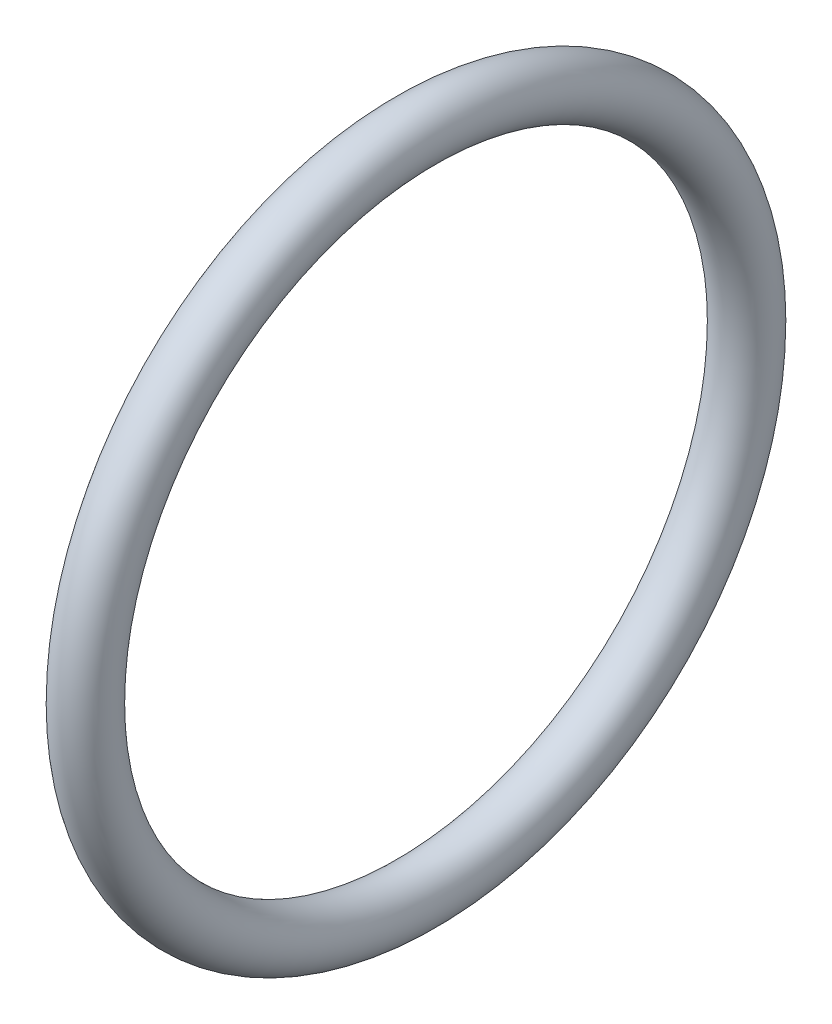
ISO-10303-21;
HEADER;
FILE_DESCRIPTION(('STEP AP214'),'2;1');
FILE_NAME('part.step','',(''),(''),'','','');
FILE_SCHEMA(('AUTOMOTIVE_DESIGN { 1 0 10303 214 1 1 1 1 }'));
ENDSEC;
DATA;
#1=APPLICATION_CONTEXT('core data for automotive mechanical design processes');
#2=APPLICATION_PROTOCOL_DEFINITION('international standard','automotive_design',2000,#1);
#3=PRODUCT_CONTEXT('',#1,'mechanical');
#4=PRODUCT('Part','Part','',(#3));
#5=PRODUCT_RELATED_PRODUCT_CATEGORY('part','',(#4));
#6=PRODUCT_DEFINITION_FORMATION('','',#4);
#7=PRODUCT_DEFINITION_CONTEXT('part definition',#1,'design');
#8=PRODUCT_DEFINITION('design','',#6,#7);
#9=PRODUCT_DEFINITION_SHAPE('','',#8);
#10=(LENGTH_UNIT() NAMED_UNIT(*) SI_UNIT(.MILLI.,.METRE.));
#11=(NAMED_UNIT(*) PLANE_ANGLE_UNIT() SI_UNIT($,.RADIAN.));
#12=(NAMED_UNIT(*) SI_UNIT($,.STERADIAN.) SOLID_ANGLE_UNIT());
#13=UNCERTAINTY_MEASURE_WITH_UNIT(LENGTH_MEASURE(1.E-05),#10,'distance_accuracy_value','');
#14=(GEOMETRIC_REPRESENTATION_CONTEXT(3) GLOBAL_UNCERTAINTY_ASSIGNED_CONTEXT((#13)) GLOBAL_UNIT_ASSIGNED_CONTEXT((#10,
#11,#12)) REPRESENTATION_CONTEXT('',''));
#15=CARTESIAN_POINT('',(0.,0.,0.));
#16=DIRECTION('',(0.,0.,1.));
#17=DIRECTION('',(1.,0.,0.));
#18=AXIS2_PLACEMENT_3D('',#15,#16,#17);
#19=CARTESIAN_POINT('',(0.,0.,0.));
#20=DIRECTION('',(-1.,0.,0.));
#21=DIRECTION('',(0.,0.,1.));
#22=AXIS2_PLACEMENT_3D('',#19,#20,#21);
#23=TOROIDAL_SURFACE('',#22,32.75,2.75);
#24=CARTESIAN_POINT('',(0.,0.,35.5));
#25=VERTEX_POINT('',#24);
#26=VERTEX_LOOP('',#25);
#27=FACE_BOUND('',#26,.T.);
#28=ADVANCED_FACE('F13',(#27),#23,.T.);
#29=CLOSED_SHELL('',(#28));
#30=MANIFOLD_SOLID_BREP('B1',#29);
#31=ADVANCED_BREP_SHAPE_REPRESENTATION('',(#18,#30),#14);
#32=SHAPE_DEFINITION_REPRESENTATION(#9,#31);
ENDSEC;
END-ISO-10303-21;
